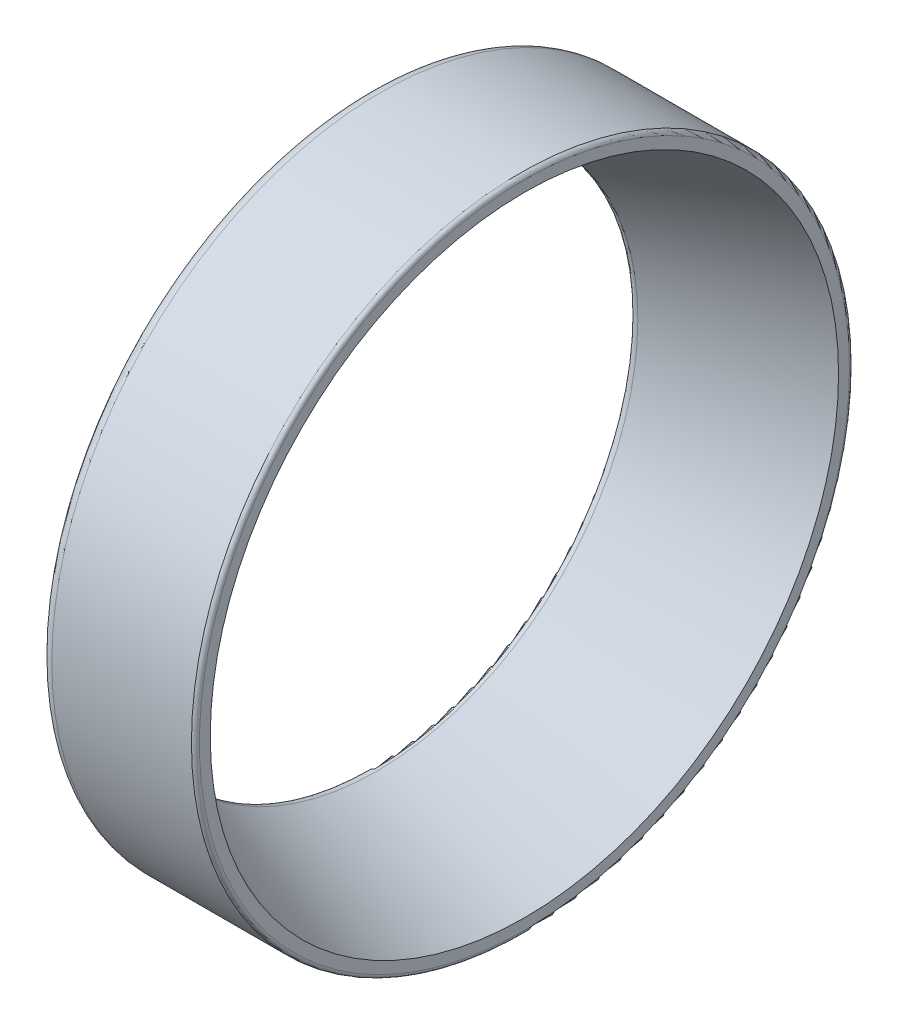
ISO-10303-21;
HEADER;
FILE_DESCRIPTION(('STEP AP214'),'2;1');
FILE_NAME('part.step','',(''),(''),'','','');
FILE_SCHEMA(('AUTOMOTIVE_DESIGN { 1 0 10303 214 1 1 1 1 }'));
ENDSEC;
DATA;
#1=APPLICATION_CONTEXT('core data for automotive mechanical design processes');
#2=APPLICATION_PROTOCOL_DEFINITION('international standard','automotive_design',2000,#1);
#3=PRODUCT_CONTEXT('',#1,'mechanical');
#4=PRODUCT('Part','Part','',(#3));
#5=PRODUCT_RELATED_PRODUCT_CATEGORY('part','',(#4));
#6=PRODUCT_DEFINITION_FORMATION('','',#4);
#7=PRODUCT_DEFINITION_CONTEXT('part definition',#1,'design');
#8=PRODUCT_DEFINITION('design','',#6,#7);
#9=PRODUCT_DEFINITION_SHAPE('','',#8);
#10=(LENGTH_UNIT() NAMED_UNIT(*) SI_UNIT(.MILLI.,.METRE.));
#11=(NAMED_UNIT(*) PLANE_ANGLE_UNIT() SI_UNIT($,.RADIAN.));
#12=(NAMED_UNIT(*) SI_UNIT($,.STERADIAN.) SOLID_ANGLE_UNIT());
#13=UNCERTAINTY_MEASURE_WITH_UNIT(LENGTH_MEASURE(1.E-05),#10,'distance_accuracy_value','');
#14=(GEOMETRIC_REPRESENTATION_CONTEXT(3) GLOBAL_UNCERTAINTY_ASSIGNED_CONTEXT((#13)) GLOBAL_UNIT_ASSIGNED_CONTEXT((#10,
#11,#12)) REPRESENTATION_CONTEXT('',''));
#15=CARTESIAN_POINT('',(0.,0.,0.));
#16=DIRECTION('',(0.,0.,1.));
#17=DIRECTION('',(1.,0.,0.));
#18=AXIS2_PLACEMENT_3D('',#15,#16,#17);
#19=CARTESIAN_POINT('',(0.,26.5,0.));
#20=DIRECTION('',(-1.,0.,0.));
#21=DIRECTION('',(0.,0.,1.));
#22=AXIS2_PLACEMENT_3D('',#19,#20,#21);
#23=PLANE('',#22);
#24=CARTESIAN_POINT('',(0.,0.,0.));
#25=DIRECTION('',(1.,0.,0.));
#26=DIRECTION('',(0.,0.,-1.));
#27=AXIS2_PLACEMENT_3D('',#24,#25,#26);
#28=CIRCLE('',#27,22.2808474153616);
#29=CARTESIAN_POINT('',(0.,0.,-22.2808474153616));
#30=VERTEX_POINT('',#29);
#31=EDGE_CURVE('E10',#30,#30,#28,.T.);
#32=ORIENTED_EDGE('',*,*,#31,.T.);
#33=EDGE_LOOP('',(#32));
#34=FACE_BOUND('',#33,.T.);
#35=CARTESIAN_POINT('',(0.,0.,0.));
#36=DIRECTION('',(1.,0.,0.));
#37=DIRECTION('',(0.,0.,-1.));
#38=AXIS2_PLACEMENT_3D('',#35,#36,#37);
#39=CIRCLE('',#38,26.5);
#40=CARTESIAN_POINT('',(0.,0.,-26.5));
#41=VERTEX_POINT('',#40);
#42=EDGE_CURVE('E40',#41,#41,#39,.T.);
#43=ORIENTED_EDGE('',*,*,#42,.F.);
#44=EDGE_LOOP('',(#43));
#45=FACE_BOUND('',#44,.T.);
#46=ADVANCED_FACE('F15',(#34,#45),#23,.T.);
#47=CARTESIAN_POINT('',(0.499999999999999,0.,0.));
#48=DIRECTION('',(1.,0.,0.));
#49=DIRECTION('',(0.,0.,-1.));
#50=AXIS2_PLACEMENT_3D('',#47,#48,#49);
#51=TOROIDAL_SURFACE('',#50,22.2808474153616,0.499999999999999);
#52=CARTESIAN_POINT('',(0.669639886225657,0.,0.));
#53=DIRECTION('',(1.,0.,0.));
#54=DIRECTION('',(0.,0.,-1.));
#55=AXIS2_PLACEMENT_3D('',#52,#53,#54);
#56=CIRCLE('',#55,21.8105046584264);
#57=CARTESIAN_POINT('',(0.669639886225657,0.,-21.8105046584264));
#58=VERTEX_POINT('',#57);
#59=EDGE_CURVE('E21',#58,#58,#56,.T.);
#60=ORIENTED_EDGE('',*,*,#59,.T.);
#61=EDGE_LOOP('',(#60));
#62=FACE_BOUND('',#61,.T.);
#63=ORIENTED_EDGE('',*,*,#31,.F.);
#64=EDGE_LOOP('',(#63));
#65=FACE_BOUND('',#64,.T.);
#66=ADVANCED_FACE('F48',(#62,#65),#51,.T.);
#67=CARTESIAN_POINT('',(0.669639886225657,0.,0.));
#68=DIRECTION('',(1.,0.,0.));
#69=DIRECTION('',(0.,0.,-1.));
#70=AXIS2_PLACEMENT_3D('',#67,#68,#69);
#71=CONICAL_SURFACE('',#70,21.8105046584264,0.346151150548035);
#72=CARTESIAN_POINT('',(13.,0.,0.));
#73=DIRECTION('',(1.,0.,0.));
#74=DIRECTION('',(0.,0.,-1.));
#75=AXIS2_PLACEMENT_3D('',#72,#73,#74);
#76=CIRCLE('',#75,26.2577314010092);
#77=CARTESIAN_POINT('',(13.,0.,-26.2577314010092));
#78=VERTEX_POINT('',#77);
#79=EDGE_CURVE('E25',#78,#78,#76,.T.);
#80=ORIENTED_EDGE('',*,*,#79,.T.);
#81=EDGE_LOOP('',(#80));
#82=FACE_BOUND('',#81,.T.);
#83=ORIENTED_EDGE('',*,*,#59,.F.);
#84=EDGE_LOOP('',(#83));
#85=FACE_BOUND('',#84,.T.);
#86=ADVANCED_FACE('F53',(#82,#85),#71,.F.);
#87=CARTESIAN_POINT('',(13.,26.2577314010092,0.));
#88=DIRECTION('',(1.,0.,0.));
#89=DIRECTION('',(0.,0.,-1.));
#90=AXIS2_PLACEMENT_3D('',#87,#88,#89);
#91=PLANE('',#90);
#92=CARTESIAN_POINT('',(13.,0.,0.));
#93=DIRECTION('',(1.,0.,0.));
#94=DIRECTION('',(0.,0.,-1.));
#95=AXIS2_PLACEMENT_3D('',#92,#93,#94);
#96=CIRCLE('',#95,27.1666666666667);
#97=CARTESIAN_POINT('',(13.,0.,-27.1666666666667));
#98=VERTEX_POINT('',#97);
#99=EDGE_CURVE('E29',#98,#98,#96,.T.);
#100=ORIENTED_EDGE('',*,*,#99,.T.);
#101=EDGE_LOOP('',(#100));
#102=FACE_BOUND('',#101,.T.);
#103=ORIENTED_EDGE('',*,*,#79,.F.);
#104=EDGE_LOOP('',(#103));
#105=FACE_BOUND('',#104,.T.);
#106=ADVANCED_FACE('F57',(#102,#105),#91,.T.);
#107=CARTESIAN_POINT('',(12.6666666666667,0.,0.));
#108=DIRECTION('',(1.,0.,0.));
#109=DIRECTION('',(0.,0.,-1.));
#110=AXIS2_PLACEMENT_3D('',#107,#108,#109);
#111=TOROIDAL_SURFACE('',#110,27.1666666666667,0.333333333333335);
#112=CARTESIAN_POINT('',(12.6666666666667,0.,0.));
#113=DIRECTION('',(1.,0.,0.));
#114=DIRECTION('',(0.,0.,-1.));
#115=AXIS2_PLACEMENT_3D('',#112,#113,#114);
#116=CIRCLE('',#115,27.5);
#117=CARTESIAN_POINT('',(12.6666666666667,0.,-27.5));
#118=VERTEX_POINT('',#117);
#119=EDGE_CURVE('E34',#118,#118,#116,.T.);
#120=ORIENTED_EDGE('',*,*,#119,.T.);
#121=EDGE_LOOP('',(#120));
#122=FACE_BOUND('',#121,.T.);
#123=ORIENTED_EDGE('',*,*,#99,.F.);
#124=EDGE_LOOP('',(#123));
#125=FACE_BOUND('',#124,.T.);
#126=ADVANCED_FACE('F64',(#122,#125),#111,.T.);
#127=CARTESIAN_POINT('',(13.,0.,0.));
#128=DIRECTION('',(1.,0.,0.));
#129=DIRECTION('',(0.,0.,-1.));
#130=AXIS2_PLACEMENT_3D('',#127,#128,#129);
#131=CYLINDRICAL_SURFACE('',#130,27.5);
#132=CARTESIAN_POINT('',(1.,0.,0.));
#133=DIRECTION('',(1.,0.,0.));
#134=DIRECTION('',(0.,0.,-1.));
#135=AXIS2_PLACEMENT_3D('',#132,#133,#134);
#136=CIRCLE('',#135,27.5);
#137=CARTESIAN_POINT('',(1.,0.,-27.5));
#138=VERTEX_POINT('',#137);
#139=EDGE_CURVE('E37',#138,#138,#136,.T.);
#140=ORIENTED_EDGE('',*,*,#139,.T.);
#141=EDGE_LOOP('',(#140));
#142=FACE_BOUND('',#141,.T.);
#143=ORIENTED_EDGE('',*,*,#119,.F.);
#144=EDGE_LOOP('',(#143));
#145=FACE_BOUND('',#144,.T.);
#146=ADVANCED_FACE('F68',(#142,#145),#131,.T.);
#147=CARTESIAN_POINT('',(0.999999999999999,0.,0.));
#148=DIRECTION('',(1.,0.,0.));
#149=DIRECTION('',(0.,0.,-1.));
#150=AXIS2_PLACEMENT_3D('',#147,#148,#149);
#151=TOROIDAL_SURFACE('',#150,26.5,0.999999999999997);
#152=ORIENTED_EDGE('',*,*,#42,.T.);
#153=EDGE_LOOP('',(#152));
#154=FACE_BOUND('',#153,.T.);
#155=ORIENTED_EDGE('',*,*,#139,.F.);
#156=EDGE_LOOP('',(#155));
#157=FACE_BOUND('',#156,.T.);
#158=ADVANCED_FACE('F44',(#154,#157),#151,.T.);
#159=CLOSED_SHELL('',(#46,#66,#86,#106,#126,#146,#158));
#160=MANIFOLD_SOLID_BREP('B1',#159);
#161=ADVANCED_BREP_SHAPE_REPRESENTATION('',(#18,#160),#14);
#162=SHAPE_DEFINITION_REPRESENTATION(#9,#161);
ENDSEC;
END-ISO-10303-21;
